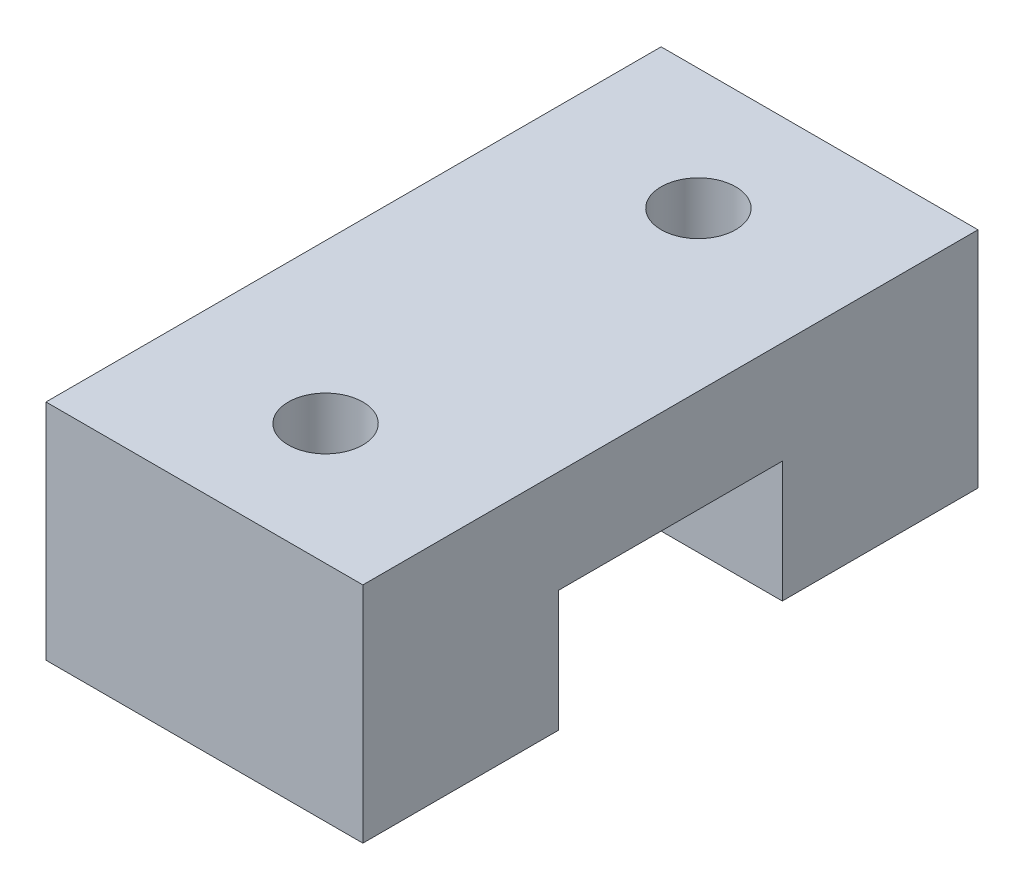
ISO-10303-21;
HEADER;
FILE_DESCRIPTION(('STEP AP214'),'2;1');
FILE_NAME('part.step','',(''),(''),'','','');
FILE_SCHEMA(('AUTOMOTIVE_DESIGN { 1 0 10303 214 1 1 1 1 }'));
ENDSEC;
DATA;
#1=APPLICATION_CONTEXT('core data for automotive mechanical design processes');
#2=APPLICATION_PROTOCOL_DEFINITION('international standard','automotive_design',2000,#1);
#3=PRODUCT_CONTEXT('',#1,'mechanical');
#4=PRODUCT('Part','Part','',(#3));
#5=PRODUCT_RELATED_PRODUCT_CATEGORY('part','',(#4));
#6=PRODUCT_DEFINITION_FORMATION('','',#4);
#7=PRODUCT_DEFINITION_CONTEXT('part definition',#1,'design');
#8=PRODUCT_DEFINITION('design','',#6,#7);
#9=PRODUCT_DEFINITION_SHAPE('','',#8);
#10=(LENGTH_UNIT() NAMED_UNIT(*) SI_UNIT(.MILLI.,.METRE.));
#11=(NAMED_UNIT(*) PLANE_ANGLE_UNIT() SI_UNIT($,.RADIAN.));
#12=(NAMED_UNIT(*) SI_UNIT($,.STERADIAN.) SOLID_ANGLE_UNIT());
#13=UNCERTAINTY_MEASURE_WITH_UNIT(LENGTH_MEASURE(1.E-05),#10,'distance_accuracy_value','');
#14=(GEOMETRIC_REPRESENTATION_CONTEXT(3) GLOBAL_UNCERTAINTY_ASSIGNED_CONTEXT((#13)) GLOBAL_UNIT_ASSIGNED_CONTEXT((#10,
#11,#12)) REPRESENTATION_CONTEXT('',''));
#15=CARTESIAN_POINT('',(0.,0.,0.));
#16=DIRECTION('',(0.,0.,1.));
#17=DIRECTION('',(1.,0.,0.));
#18=AXIS2_PLACEMENT_3D('',#15,#16,#17);
#19=CARTESIAN_POINT('',(0.,0.,0.));
#20=DIRECTION('',(0.,-1.,0.));
#21=DIRECTION('',(0.,0.,-1.));
#22=AXIS2_PLACEMENT_3D('',#19,#20,#21);
#23=PLANE('',#22);
#24=DIRECTION('',(1.,0.,0.));
#25=VECTOR('',#24,1.);
#26=CARTESIAN_POINT('',(-8.5,0.,6.));
#27=LINE('',#26,#25);
#28=CARTESIAN_POINT('',(-8.5,0.,6.));
#29=VERTEX_POINT('',#28);
#30=CARTESIAN_POINT('',(8.5,0.,6.));
#31=VERTEX_POINT('',#30);
#32=EDGE_CURVE('E118',#29,#31,#27,.T.);
#33=ORIENTED_EDGE('',*,*,#32,.T.);
#34=DIRECTION('',(0.,0.,-1.));
#35=VECTOR('',#34,1.);
#36=CARTESIAN_POINT('',(8.5,0.,16.5));
#37=LINE('',#36,#35);
#38=CARTESIAN_POINT('',(8.5,0.,16.5));
#39=VERTEX_POINT('',#38);
#40=EDGE_CURVE('E149',#39,#31,#37,.T.);
#41=ORIENTED_EDGE('',*,*,#40,.F.);
#42=DIRECTION('',(1.,0.,0.));
#43=VECTOR('',#42,1.);
#44=CARTESIAN_POINT('',(-8.5,0.,16.5));
#45=LINE('',#44,#43);
#46=CARTESIAN_POINT('',(-8.5,0.,16.5));
#47=VERTEX_POINT('',#46);
#48=EDGE_CURVE('E89',#47,#39,#45,.T.);
#49=ORIENTED_EDGE('',*,*,#48,.F.);
#50=DIRECTION('',(0.,0.,1.));
#51=VECTOR('',#50,1.);
#52=CARTESIAN_POINT('',(-8.5,0.,16.5));
#53=LINE('',#52,#51);
#54=EDGE_CURVE('E136',#29,#47,#53,.T.);
#55=ORIENTED_EDGE('',*,*,#54,.F.);
#56=EDGE_LOOP('',(#33,#41,#49,#55));
#57=FACE_BOUND('',#56,.T.);
#58=CARTESIAN_POINT('',(0.,0.,10.));
#59=DIRECTION('',(0.,1.,0.));
#60=DIRECTION('',(0.,0.,-1.));
#61=AXIS2_PLACEMENT_3D('',#58,#59,#60);
#62=CIRCLE('',#61,2.);
#63=CARTESIAN_POINT('',(0.,0.,8.));
#64=VERTEX_POINT('',#63);
#65=EDGE_CURVE('E194',#64,#64,#62,.T.);
#66=ORIENTED_EDGE('',*,*,#65,.T.);
#67=EDGE_LOOP('',(#66));
#68=FACE_BOUND('',#67,.T.);
#69=ADVANCED_FACE('F43',(#57,#68),#23,.T.);
#70=CARTESIAN_POINT('',(8.5,12.,16.5));
#71=DIRECTION('',(-1.,0.,0.));
#72=DIRECTION('',(0.,0.,1.));
#73=AXIS2_PLACEMENT_3D('',#70,#71,#72);
#74=PLANE('',#73);
#75=ORIENTED_EDGE('',*,*,#40,.T.);
#76=DIRECTION('',(0.,-1.,0.));
#77=VECTOR('',#76,1.);
#78=CARTESIAN_POINT('',(8.5,0.,6.));
#79=LINE('',#78,#77);
#80=CARTESIAN_POINT('',(8.5,6.5,6.));
#81=VERTEX_POINT('',#80);
#82=EDGE_CURVE('E124',#81,#31,#79,.T.);
#83=ORIENTED_EDGE('',*,*,#82,.F.);
#84=DIRECTION('',(0.,0.,1.));
#85=VECTOR('',#84,1.);
#86=CARTESIAN_POINT('',(8.5,6.5,6.));
#87=LINE('',#86,#85);
#88=CARTESIAN_POINT('',(8.5,6.5,-6.));
#89=VERTEX_POINT('',#88);
#90=EDGE_CURVE('E139',#89,#81,#87,.T.);
#91=ORIENTED_EDGE('',*,*,#90,.F.);
#92=DIRECTION('',(0.,1.,0.));
#93=VECTOR('',#92,1.);
#94=CARTESIAN_POINT('',(8.5,0.,-6.));
#95=LINE('',#94,#93);
#96=CARTESIAN_POINT('',(8.5,0.,-6.));
#97=VERTEX_POINT('',#96);
#98=EDGE_CURVE('E211',#97,#89,#95,.T.);
#99=ORIENTED_EDGE('',*,*,#98,.F.);
#100=CARTESIAN_POINT('',(8.5,0.,-16.5));
#101=VERTEX_POINT('',#100);
#102=EDGE_CURVE('E171',#97,#101,#37,.T.);
#103=ORIENTED_EDGE('',*,*,#102,.T.);
#104=DIRECTION('',(0.,-1.,0.));
#105=VECTOR('',#104,1.);
#106=CARTESIAN_POINT('',(8.5,12.,-16.5));
#107=LINE('',#106,#105);
#108=CARTESIAN_POINT('',(8.5,12.,-16.5));
#109=VERTEX_POINT('',#108);
#110=EDGE_CURVE('E11',#109,#101,#107,.T.);
#111=ORIENTED_EDGE('',*,*,#110,.F.);
#112=DIRECTION('',(0.,0.,-1.));
#113=VECTOR('',#112,1.);
#114=CARTESIAN_POINT('',(8.5,12.,16.5));
#115=LINE('',#114,#113);
#116=CARTESIAN_POINT('',(8.5,12.,16.5));
#117=VERTEX_POINT('',#116);
#118=EDGE_CURVE('E155',#117,#109,#115,.T.);
#119=ORIENTED_EDGE('',*,*,#118,.F.);
#120=DIRECTION('',(0.,-1.,0.));
#121=VECTOR('',#120,1.);
#122=CARTESIAN_POINT('',(8.5,12.,16.5));
#123=LINE('',#122,#121);
#124=EDGE_CURVE('E156',#117,#39,#123,.T.);
#125=ORIENTED_EDGE('',*,*,#124,.T.);
#126=EDGE_LOOP('',(#75,#83,#91,#99,#103,#111,#119,#125));
#127=FACE_BOUND('',#126,.T.);
#128=ADVANCED_FACE('F45',(#127),#74,.F.);
#129=CARTESIAN_POINT('',(-8.5,12.,-16.5));
#130=DIRECTION('',(0.,0.,1.));
#131=DIRECTION('',(1.,0.,0.));
#132=AXIS2_PLACEMENT_3D('',#129,#130,#131);
#133=PLANE('',#132);
#134=DIRECTION('',(-1.,0.,0.));
#135=VECTOR('',#134,1.);
#136=CARTESIAN_POINT('',(-8.5,0.,-16.5));
#137=LINE('',#136,#135);
#138=CARTESIAN_POINT('',(-8.5,0.,-16.5));
#139=VERTEX_POINT('',#138);
#140=EDGE_CURVE('E144',#101,#139,#137,.T.);
#141=ORIENTED_EDGE('',*,*,#140,.T.);
#142=DIRECTION('',(0.,-1.,0.));
#143=VECTOR('',#142,1.);
#144=CARTESIAN_POINT('',(-8.5,12.,-16.5));
#145=LINE('',#144,#143);
#146=CARTESIAN_POINT('',(-8.5,12.,-16.5));
#147=VERTEX_POINT('',#146);
#148=EDGE_CURVE('E52',#147,#139,#145,.T.);
#149=ORIENTED_EDGE('',*,*,#148,.F.);
#150=DIRECTION('',(-1.,0.,0.));
#151=VECTOR('',#150,1.);
#152=CARTESIAN_POINT('',(-8.5,12.,-16.5));
#153=LINE('',#152,#151);
#154=EDGE_CURVE('E96',#109,#147,#153,.T.);
#155=ORIENTED_EDGE('',*,*,#154,.F.);
#156=ORIENTED_EDGE('',*,*,#110,.T.);
#157=EDGE_LOOP('',(#141,#149,#155,#156));
#158=FACE_BOUND('',#157,.T.);
#159=ADVANCED_FACE('F236',(#158),#133,.F.);
#160=CARTESIAN_POINT('',(-8.5,12.,16.5));
#161=DIRECTION('',(1.,0.,0.));
#162=DIRECTION('',(0.,0.,-1.));
#163=AXIS2_PLACEMENT_3D('',#160,#161,#162);
#164=PLANE('',#163);
#165=DIRECTION('',(0.,0.,1.));
#166=VECTOR('',#165,1.);
#167=CARTESIAN_POINT('',(-8.5,6.5,6.));
#168=LINE('',#167,#166);
#169=CARTESIAN_POINT('',(-8.5,6.5,-6.));
#170=VERTEX_POINT('',#169);
#171=CARTESIAN_POINT('',(-8.5,6.5,6.));
#172=VERTEX_POINT('',#171);
#173=EDGE_CURVE('E131',#170,#172,#168,.T.);
#174=ORIENTED_EDGE('',*,*,#173,.T.);
#175=DIRECTION('',(0.,-1.,0.));
#176=VECTOR('',#175,1.);
#177=CARTESIAN_POINT('',(-8.5,0.,6.));
#178=LINE('',#177,#176);
#179=EDGE_CURVE('E121',#172,#29,#178,.T.);
#180=ORIENTED_EDGE('',*,*,#179,.T.);
#181=ORIENTED_EDGE('',*,*,#54,.T.);
#182=DIRECTION('',(0.,-1.,0.));
#183=VECTOR('',#182,1.);
#184=CARTESIAN_POINT('',(-8.5,12.,16.5));
#185=LINE('',#184,#183);
#186=CARTESIAN_POINT('',(-8.5,12.,16.5));
#187=VERTEX_POINT('',#186);
#188=EDGE_CURVE('E159',#187,#47,#185,.T.);
#189=ORIENTED_EDGE('',*,*,#188,.F.);
#190=DIRECTION('',(0.,0.,1.));
#191=VECTOR('',#190,1.);
#192=CARTESIAN_POINT('',(-8.5,12.,16.5));
#193=LINE('',#192,#191);
#194=EDGE_CURVE('E165',#147,#187,#193,.T.);
#195=ORIENTED_EDGE('',*,*,#194,.F.);
#196=ORIENTED_EDGE('',*,*,#148,.T.);
#197=CARTESIAN_POINT('',(-8.5,0.,-6.));
#198=VERTEX_POINT('',#197);
#199=EDGE_CURVE('E143',#139,#198,#53,.T.);
#200=ORIENTED_EDGE('',*,*,#199,.T.);
#201=DIRECTION('',(0.,1.,0.));
#202=VECTOR('',#201,1.);
#203=CARTESIAN_POINT('',(-8.5,0.,-6.));
#204=LINE('',#203,#202);
#205=EDGE_CURVE('E59',#198,#170,#204,.T.);
#206=ORIENTED_EDGE('',*,*,#205,.T.);
#207=EDGE_LOOP('',(#174,#180,#181,#189,#195,#196,#200,#206));
#208=FACE_BOUND('',#207,.T.);
#209=ADVANCED_FACE('F134',(#208),#164,.F.);
#210=CARTESIAN_POINT('',(-8.5,12.,16.5));
#211=DIRECTION('',(0.,0.,-1.));
#212=DIRECTION('',(-1.,0.,0.));
#213=AXIS2_PLACEMENT_3D('',#210,#211,#212);
#214=PLANE('',#213);
#215=ORIENTED_EDGE('',*,*,#48,.T.);
#216=ORIENTED_EDGE('',*,*,#124,.F.);
#217=DIRECTION('',(1.,0.,0.));
#218=VECTOR('',#217,1.);
#219=CARTESIAN_POINT('',(-8.5,12.,16.5));
#220=LINE('',#219,#218);
#221=EDGE_CURVE('E68',#187,#117,#220,.T.);
#222=ORIENTED_EDGE('',*,*,#221,.F.);
#223=ORIENTED_EDGE('',*,*,#188,.T.);
#224=EDGE_LOOP('',(#215,#216,#222,#223));
#225=FACE_BOUND('',#224,.T.);
#226=ADVANCED_FACE('F249',(#225),#214,.F.);
#227=CARTESIAN_POINT('',(0.,12.,0.));
#228=DIRECTION('',(0.,-1.,0.));
#229=DIRECTION('',(0.,0.,-1.));
#230=AXIS2_PLACEMENT_3D('',#227,#228,#229);
#231=PLANE('',#230);
#232=CARTESIAN_POINT('',(0.,12.,-10.));
#233=DIRECTION('',(0.,1.,0.));
#234=DIRECTION('',(0.,0.,1.));
#235=AXIS2_PLACEMENT_3D('',#232,#233,#234);
#236=CIRCLE('',#235,2.);
#237=CARTESIAN_POINT('',(0.,12.,-8.));
#238=VERTEX_POINT('',#237);
#239=EDGE_CURVE('E186',#238,#238,#236,.T.);
#240=ORIENTED_EDGE('',*,*,#239,.F.);
#241=EDGE_LOOP('',(#240));
#242=FACE_BOUND('',#241,.T.);
#243=CARTESIAN_POINT('',(0.,12.,10.));
#244=DIRECTION('',(0.,1.,0.));
#245=DIRECTION('',(0.,0.,-1.));
#246=AXIS2_PLACEMENT_3D('',#243,#244,#245);
#247=CIRCLE('',#246,2.);
#248=CARTESIAN_POINT('',(0.,12.,8.));
#249=VERTEX_POINT('',#248);
#250=EDGE_CURVE('E190',#249,#249,#247,.T.);
#251=ORIENTED_EDGE('',*,*,#250,.F.);
#252=EDGE_LOOP('',(#251));
#253=FACE_BOUND('',#252,.T.);
#254=ORIENTED_EDGE('',*,*,#118,.T.);
#255=ORIENTED_EDGE('',*,*,#154,.T.);
#256=ORIENTED_EDGE('',*,*,#194,.T.);
#257=ORIENTED_EDGE('',*,*,#221,.T.);
#258=EDGE_LOOP('',(#254,#255,#256,#257));
#259=FACE_BOUND('',#258,.T.);
#260=ADVANCED_FACE('F241',(#242,#253,#259),#231,.F.);
#261=DIRECTION('',(1.,0.,0.));
#262=VECTOR('',#261,1.);
#263=CARTESIAN_POINT('',(-8.5,0.,-6.));
#264=LINE('',#263,#262);
#265=EDGE_CURVE('E130',#198,#97,#264,.T.);
#266=ORIENTED_EDGE('',*,*,#265,.F.);
#267=ORIENTED_EDGE('',*,*,#199,.F.);
#268=ORIENTED_EDGE('',*,*,#140,.F.);
#269=ORIENTED_EDGE('',*,*,#102,.F.);
#270=EDGE_LOOP('',(#266,#267,#268,#269));
#271=FACE_BOUND('',#270,.T.);
#272=CARTESIAN_POINT('',(0.,0.,-10.));
#273=DIRECTION('',(0.,1.,0.));
#274=DIRECTION('',(0.,0.,1.));
#275=AXIS2_PLACEMENT_3D('',#272,#273,#274);
#276=CIRCLE('',#275,2.);
#277=CARTESIAN_POINT('',(0.,0.,-8.));
#278=VERTEX_POINT('',#277);
#279=EDGE_CURVE('E182',#278,#278,#276,.T.);
#280=ORIENTED_EDGE('',*,*,#279,.T.);
#281=EDGE_LOOP('',(#280));
#282=FACE_BOUND('',#281,.T.);
#283=ADVANCED_FACE('F168',(#271,#282),#23,.T.);
#284=CARTESIAN_POINT('',(0.,0.,10.));
#285=DIRECTION('',(0.,1.,0.));
#286=DIRECTION('',(0.,0.,1.));
#287=AXIS2_PLACEMENT_3D('',#284,#285,#286);
#288=CYLINDRICAL_SURFACE('',#287,2.);
#289=ORIENTED_EDGE('',*,*,#65,.F.);
#290=EDGE_LOOP('',(#289));
#291=FACE_BOUND('',#290,.T.);
#292=ORIENTED_EDGE('',*,*,#250,.T.);
#293=EDGE_LOOP('',(#292));
#294=FACE_BOUND('',#293,.T.);
#295=ADVANCED_FACE('F240',(#291,#294),#288,.F.);
#296=CARTESIAN_POINT('',(0.,0.,-10.));
#297=DIRECTION('',(0.,1.,0.));
#298=DIRECTION('',(0.,0.,1.));
#299=AXIS2_PLACEMENT_3D('',#296,#297,#298);
#300=CYLINDRICAL_SURFACE('',#299,2.);
#301=ORIENTED_EDGE('',*,*,#279,.F.);
#302=EDGE_LOOP('',(#301));
#303=FACE_BOUND('',#302,.T.);
#304=ORIENTED_EDGE('',*,*,#239,.T.);
#305=EDGE_LOOP('',(#304));
#306=FACE_BOUND('',#305,.T.);
#307=ADVANCED_FACE('F246',(#303,#306),#300,.F.);
#308=CARTESIAN_POINT('',(-8.5,0.,6.));
#309=DIRECTION('',(0.,0.,1.));
#310=DIRECTION('',(1.,0.,0.));
#311=AXIS2_PLACEMENT_3D('',#308,#309,#310);
#312=PLANE('',#311);
#313=ORIENTED_EDGE('',*,*,#82,.T.);
#314=ORIENTED_EDGE('',*,*,#32,.F.);
#315=ORIENTED_EDGE('',*,*,#179,.F.);
#316=DIRECTION('',(1.,0.,0.));
#317=VECTOR('',#316,1.);
#318=CARTESIAN_POINT('',(-8.5,6.5,6.));
#319=LINE('',#318,#317);
#320=EDGE_CURVE('E178',#172,#81,#319,.T.);
#321=ORIENTED_EDGE('',*,*,#320,.T.);
#322=EDGE_LOOP('',(#313,#314,#315,#321));
#323=FACE_BOUND('',#322,.T.);
#324=ADVANCED_FACE('F120',(#323),#312,.F.);
#325=CARTESIAN_POINT('',(-8.5,6.5,6.));
#326=DIRECTION('',(0.,1.,0.));
#327=DIRECTION('',(0.,0.,1.));
#328=AXIS2_PLACEMENT_3D('',#325,#326,#327);
#329=PLANE('',#328);
#330=ORIENTED_EDGE('',*,*,#90,.T.);
#331=ORIENTED_EDGE('',*,*,#320,.F.);
#332=ORIENTED_EDGE('',*,*,#173,.F.);
#333=DIRECTION('',(1.,0.,0.));
#334=VECTOR('',#333,1.);
#335=CARTESIAN_POINT('',(-8.5,6.5,-6.));
#336=LINE('',#335,#334);
#337=EDGE_CURVE('E175',#170,#89,#336,.T.);
#338=ORIENTED_EDGE('',*,*,#337,.T.);
#339=EDGE_LOOP('',(#330,#331,#332,#338));
#340=FACE_BOUND('',#339,.T.);
#341=ADVANCED_FACE('F222',(#340),#329,.F.);
#342=CARTESIAN_POINT('',(-8.5,0.,-6.));
#343=DIRECTION('',(0.,0.,-1.));
#344=DIRECTION('',(-1.,0.,0.));
#345=AXIS2_PLACEMENT_3D('',#342,#343,#344);
#346=PLANE('',#345);
#347=ORIENTED_EDGE('',*,*,#98,.T.);
#348=ORIENTED_EDGE('',*,*,#337,.F.);
#349=ORIENTED_EDGE('',*,*,#205,.F.);
#350=ORIENTED_EDGE('',*,*,#265,.T.);
#351=EDGE_LOOP('',(#347,#348,#349,#350));
#352=FACE_BOUND('',#351,.T.);
#353=ADVANCED_FACE('F223',(#352),#346,.F.);
#354=CLOSED_SHELL('',(#69,#128,#159,#209,#226,#260,#283,#295,#307,#324,#341,#353));
#355=MANIFOLD_SOLID_BREP('B2',#354);
#356=ADVANCED_BREP_SHAPE_REPRESENTATION('',(#18,#355),#14);
#357=SHAPE_DEFINITION_REPRESENTATION(#9,#356);
ENDSEC;
END-ISO-10303-21;
